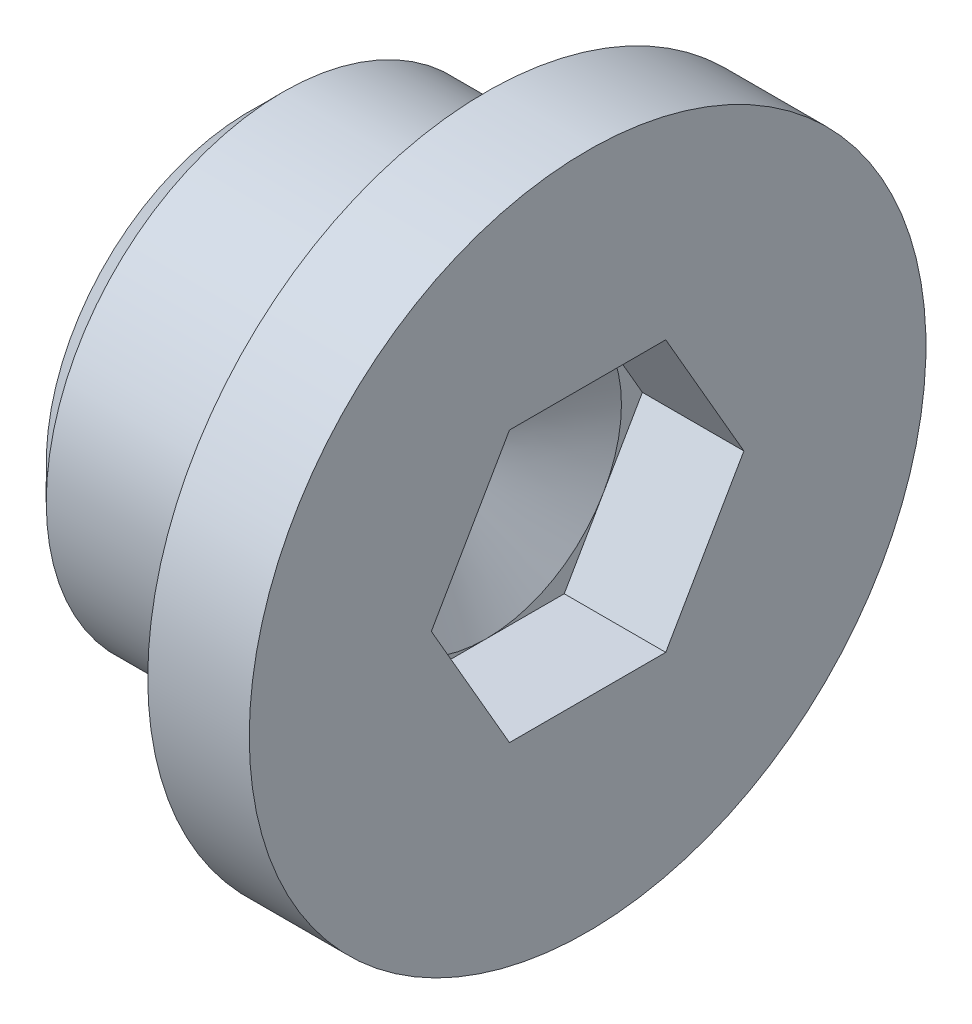
ISO-10303-21;
HEADER;
FILE_DESCRIPTION(('STEP AP214'),'2;1');
FILE_NAME('part.step','',(''),(''),'','','');
FILE_SCHEMA(('AUTOMOTIVE_DESIGN { 1 0 10303 214 1 1 1 1 }'));
ENDSEC;
DATA;
#1=APPLICATION_CONTEXT('core data for automotive mechanical design processes');
#2=APPLICATION_PROTOCOL_DEFINITION('international standard','automotive_design',2000,#1);
#3=PRODUCT_CONTEXT('',#1,'mechanical');
#4=PRODUCT('Part','Part','',(#3));
#5=PRODUCT_RELATED_PRODUCT_CATEGORY('part','',(#4));
#6=PRODUCT_DEFINITION_FORMATION('','',#4);
#7=PRODUCT_DEFINITION_CONTEXT('part definition',#1,'design');
#8=PRODUCT_DEFINITION('design','',#6,#7);
#9=PRODUCT_DEFINITION_SHAPE('','',#8);
#10=(LENGTH_UNIT() NAMED_UNIT(*) SI_UNIT(.MILLI.,.METRE.));
#11=(NAMED_UNIT(*) PLANE_ANGLE_UNIT() SI_UNIT($,.RADIAN.));
#12=(NAMED_UNIT(*) SI_UNIT($,.STERADIAN.) SOLID_ANGLE_UNIT());
#13=UNCERTAINTY_MEASURE_WITH_UNIT(LENGTH_MEASURE(1.E-05),#10,'distance_accuracy_value','');
#14=(GEOMETRIC_REPRESENTATION_CONTEXT(3) GLOBAL_UNCERTAINTY_ASSIGNED_CONTEXT((#13)) GLOBAL_UNIT_ASSIGNED_CONTEXT((#10,
#11,#12)) REPRESENTATION_CONTEXT('',''));
#15=CARTESIAN_POINT('',(0.,0.,0.));
#16=DIRECTION('',(0.,0.,1.));
#17=DIRECTION('',(1.,0.,0.));
#18=AXIS2_PLACEMENT_3D('',#15,#16,#17);
#19=CARTESIAN_POINT('',(10.,10.,0.));
#20=DIRECTION('',(-1.,0.,0.));
#21=DIRECTION('',(0.,0.,1.));
#22=AXIS2_PLACEMENT_3D('',#19,#20,#21);
#23=PLANE('',#22);
#24=DIRECTION('',(0.,0.,-1.));
#25=VECTOR('',#24,1.);
#26=CARTESIAN_POINT('',(10.,-4.,2.3094010767585));
#27=LINE('',#26,#25);
#28=CARTESIAN_POINT('',(10.,-4.,2.3094010767585));
#29=VERTEX_POINT('',#28);
#30=CARTESIAN_POINT('',(10.,-3.99999999999999,-2.30940107675846));
#31=VERTEX_POINT('',#30);
#32=EDGE_CURVE('E49',#29,#31,#27,.T.);
#33=ORIENTED_EDGE('',*,*,#32,.F.);
#34=DIRECTION('',(0.,-0.866025403784442,-0.499999999999993));
#35=VECTOR('',#34,1.);
#36=CARTESIAN_POINT('',(10.,0.,4.61880215351696));
#37=LINE('',#36,#35);
#38=CARTESIAN_POINT('',(10.,0.,4.61880215351696));
#39=VERTEX_POINT('',#38);
#40=EDGE_CURVE('E125',#39,#29,#37,.T.);
#41=ORIENTED_EDGE('',*,*,#40,.F.);
#42=DIRECTION('',(0.,-0.866025403784442,0.499999999999993));
#43=VECTOR('',#42,1.);
#44=CARTESIAN_POINT('',(10.,0.,4.61880215351696));
#45=LINE('',#44,#43);
#46=CARTESIAN_POINT('',(10.,4.,2.3094010767585));
#47=VERTEX_POINT('',#46);
#48=EDGE_CURVE('E119',#47,#39,#45,.T.);
#49=ORIENTED_EDGE('',*,*,#48,.F.);
#50=DIRECTION('',(0.,0.,1.));
#51=VECTOR('',#50,1.);
#52=CARTESIAN_POINT('',(10.,4.,2.3094010767585));
#53=LINE('',#52,#51);
#54=CARTESIAN_POINT('',(10.,4.,-2.30940107675848));
#55=VERTEX_POINT('',#54);
#56=EDGE_CURVE('E157',#55,#47,#53,.T.);
#57=ORIENTED_EDGE('',*,*,#56,.F.);
#58=DIRECTION('',(0.,0.866025403784442,0.499999999999993));
#59=VECTOR('',#58,1.);
#60=CARTESIAN_POINT('',(10.,0.,-4.61880215351693));
#61=LINE('',#60,#59);
#62=CARTESIAN_POINT('',(10.,0.,-4.61880215351693));
#63=VERTEX_POINT('',#62);
#64=EDGE_CURVE('E154',#63,#55,#61,.T.);
#65=ORIENTED_EDGE('',*,*,#64,.F.);
#66=DIRECTION('',(0.,0.866025403784442,-0.499999999999993));
#67=VECTOR('',#66,1.);
#68=CARTESIAN_POINT('',(10.,0.,-4.61880215351693));
#69=LINE('',#68,#67);
#70=EDGE_CURVE('E151',#31,#63,#69,.T.);
#71=ORIENTED_EDGE('',*,*,#70,.F.);
#72=EDGE_LOOP('',(#33,#41,#49,#57,#65,#71));
#73=FACE_BOUND('',#72,.T.);
#74=CARTESIAN_POINT('',(10.,0.,0.));
#75=DIRECTION('',(-1.,0.,0.));
#76=DIRECTION('',(0.,0.,1.));
#77=AXIS2_PLACEMENT_3D('',#74,#75,#76);
#78=CIRCLE('',#77,10.);
#79=CARTESIAN_POINT('',(10.,0.,10.));
#80=VERTEX_POINT('',#79);
#81=EDGE_CURVE('E189',#80,#80,#78,.T.);
#82=ORIENTED_EDGE('',*,*,#81,.F.);
#83=EDGE_LOOP('',(#82));
#84=FACE_BOUND('',#83,.T.);
#85=ADVANCED_FACE('F34',(#73,#84),#23,.F.);
#86=CARTESIAN_POINT('',(0.,0.,0.));
#87=DIRECTION('',(-1.,0.,0.));
#88=DIRECTION('',(0.,0.,1.));
#89=AXIS2_PLACEMENT_3D('',#86,#87,#88);
#90=CYLINDRICAL_SURFACE('',#89,10.);
#91=CARTESIAN_POINT('',(7.00000000000004,0.,0.));
#92=DIRECTION('',(-1.,0.,0.));
#93=DIRECTION('',(0.,0.,1.));
#94=AXIS2_PLACEMENT_3D('',#91,#92,#93);
#95=CIRCLE('',#94,10.);
#96=CARTESIAN_POINT('',(7.00000000000003,0.,10.));
#97=VERTEX_POINT('',#96);
#98=EDGE_CURVE('E186',#97,#97,#95,.T.);
#99=CARTESIAN_POINT('',(7.00000000000003,0.,10.));
#100=CARTESIAN_POINT('',(7.03125000000003,0.,10.));
#101=CARTESIAN_POINT('',(7.06250000000003,0.,10.));
#102=CARTESIAN_POINT('',(7.12500000000003,0.,10.));
#103=CARTESIAN_POINT('',(7.15625000000003,0.,10.));
#104=CARTESIAN_POINT('',(7.21875000000003,0.,10.));
#105=CARTESIAN_POINT('',(7.25000000000003,0.,10.));
#106=CARTESIAN_POINT('',(7.31250000000003,0.,10.));
#107=CARTESIAN_POINT('',(7.34375000000003,0.,10.));
#108=CARTESIAN_POINT('',(7.40625000000003,0.,10.));
#109=CARTESIAN_POINT('',(7.43750000000003,0.,10.));
#110=CARTESIAN_POINT('',(7.50000000000003,0.,10.));
#111=CARTESIAN_POINT('',(7.53125000000003,0.,10.));
#112=CARTESIAN_POINT('',(7.59375000000003,0.,10.));
#113=CARTESIAN_POINT('',(7.62500000000003,0.,10.));
#114=CARTESIAN_POINT('',(7.68750000000003,0.,10.));
#115=CARTESIAN_POINT('',(7.71875000000003,0.,10.));
#116=CARTESIAN_POINT('',(7.78125000000003,0.,10.));
#117=CARTESIAN_POINT('',(7.81250000000003,0.,10.));
#118=CARTESIAN_POINT('',(7.87500000000003,0.,10.));
#119=CARTESIAN_POINT('',(7.90625000000003,0.,10.));
#120=CARTESIAN_POINT('',(7.96875000000003,0.,10.));
#121=CARTESIAN_POINT('',(8.00000000000003,0.,10.));
#122=CARTESIAN_POINT('',(8.06250000000003,0.,10.));
#123=CARTESIAN_POINT('',(8.09375000000003,0.,10.));
#124=CARTESIAN_POINT('',(8.15625000000003,0.,10.));
#125=CARTESIAN_POINT('',(8.18750000000003,0.,10.));
#126=CARTESIAN_POINT('',(8.25000000000003,0.,10.));
#127=CARTESIAN_POINT('',(8.28125000000003,0.,10.));
#128=CARTESIAN_POINT('',(8.34375000000003,0.,10.));
#129=CARTESIAN_POINT('',(8.37500000000003,0.,10.));
#130=CARTESIAN_POINT('',(8.43750000000003,0.,10.));
#131=CARTESIAN_POINT('',(8.46875000000003,0.,10.));
#132=CARTESIAN_POINT('',(8.53125000000003,0.,10.));
#133=CARTESIAN_POINT('',(8.56250000000003,0.,10.));
#134=CARTESIAN_POINT('',(8.62500000000003,0.,10.));
#135=CARTESIAN_POINT('',(8.65625000000003,0.,10.));
#136=CARTESIAN_POINT('',(8.71875000000003,0.,10.));
#137=CARTESIAN_POINT('',(8.75000000000003,0.,10.));
#138=CARTESIAN_POINT('',(8.81250000000003,0.,10.));
#139=CARTESIAN_POINT('',(8.84375000000003,0.,10.));
#140=CARTESIAN_POINT('',(8.90625000000003,0.,10.));
#141=CARTESIAN_POINT('',(8.93750000000003,0.,10.));
#142=CARTESIAN_POINT('',(9.00000000000003,0.,10.));
#143=CARTESIAN_POINT('',(9.03125000000003,0.,10.));
#144=CARTESIAN_POINT('',(9.09375000000003,0.,10.));
#145=CARTESIAN_POINT('',(9.12500000000003,0.,10.));
#146=CARTESIAN_POINT('',(9.18750000000003,0.,10.));
#147=CARTESIAN_POINT('',(9.21875000000003,0.,10.));
#148=CARTESIAN_POINT('',(9.28125000000003,0.,10.));
#149=CARTESIAN_POINT('',(9.31250000000003,0.,10.));
#150=CARTESIAN_POINT('',(9.37500000000003,0.,10.));
#151=CARTESIAN_POINT('',(9.40625000000002,0.,10.));
#152=CARTESIAN_POINT('',(9.46875000000002,0.,10.));
#153=CARTESIAN_POINT('',(9.50000000000003,0.,10.));
#154=CARTESIAN_POINT('',(9.56250000000003,0.,10.));
#155=CARTESIAN_POINT('',(9.59375000000003,0.,10.));
#156=CARTESIAN_POINT('',(9.65625000000003,0.,10.));
#157=CARTESIAN_POINT('',(9.68750000000003,0.,10.));
#158=CARTESIAN_POINT('',(9.75000000000003,0.,10.));
#159=CARTESIAN_POINT('',(9.78125000000002,0.,10.));
#160=CARTESIAN_POINT('',(9.84375000000002,0.,10.));
#161=CARTESIAN_POINT('',(9.87500000000002,0.,10.));
#162=CARTESIAN_POINT('',(9.93750000000002,0.,10.));
#163=CARTESIAN_POINT('',(9.96875000000002,0.,10.));
#164=CARTESIAN_POINT('',(10.,0.,10.));
#165=B_SPLINE_CURVE_WITH_KNOTS('',3,(#99,#100,#101,#102,#103,#104,#105,#106,#107,#108,#109,#110,
#111,#112,#113,#114,#115,#116,#117,#118,#119,#120,#121,#122,#123,#124,#125,#126,#127,#128,#129,
#130,#131,#132,#133,#134,#135,#136,#137,#138,#139,#140,#141,#142,#143,#144,#145,#146,#147,#148,
#149,#150,#151,#152,#153,#154,#155,#156,#157,#158,#159,#160,#161,#162,#163,#164),.UNSPECIFIED.,
.F.,.F.,(4,2,2,2,2,2,2,2,2,2,2,2,2,2,2,2,2,2,2,2,2,2,2,2,2,2,2,2,2,2,2,2,4),(0.,
0.0937500000000001,0.187499999999999,0.281249999999999,0.374999999999999,0.468749999999999,
0.562499999999998,0.656249999999998,0.749999999999997,0.843749999999996,0.937499999999996,
1.03125,1.12499999999999,1.21875,1.3125,1.40625,1.5,1.59374999999999,1.68749999999999,
1.78124999999999,1.87499999999999,1.96874999999999,2.06249999999999,2.15624999999999,
2.24999999999999,2.34374999999999,2.43749999999999,2.53124999999999,2.62499999999999,
2.71874999999999,2.81249999999999,2.90624999999999,2.99999999999999),.UNSPECIFIED.);
#166=EDGE_CURVE('BSEAM207',#97,#80,#165,.T.);
#167=ORIENTED_EDGE('',*,*,#98,.F.);
#168=ORIENTED_EDGE('',*,*,#81,.T.);
#169=ORIENTED_EDGE('',*,*,#166,.T.);
#170=ORIENTED_EDGE('',*,*,#166,.F.);
#171=EDGE_LOOP('',(#167,#169,#168,#170));
#172=FACE_BOUND('',#171,.T.);
#173=ADVANCED_FACE('F207',(#172),#90,.T.);
#174=CARTESIAN_POINT('',(7.,7.,0.));
#175=DIRECTION('',(1.,0.,0.));
#176=DIRECTION('',(0.,0.,-1.));
#177=AXIS2_PLACEMENT_3D('',#174,#175,#176);
#178=PLANE('',#177);
#179=CARTESIAN_POINT('',(7.00000000000004,0.,0.));
#180=DIRECTION('',(-1.,0.,0.));
#181=DIRECTION('',(0.,0.,1.));
#182=AXIS2_PLACEMENT_3D('',#179,#180,#181);
#183=CIRCLE('',#182,7.);
#184=CARTESIAN_POINT('',(7.00000000000004,0.,7.));
#185=VERTEX_POINT('',#184);
#186=EDGE_CURVE('E183',#185,#185,#183,.T.);
#187=ORIENTED_EDGE('',*,*,#186,.F.);
#188=EDGE_LOOP('',(#187));
#189=FACE_BOUND('',#188,.T.);
#190=ORIENTED_EDGE('',*,*,#98,.T.);
#191=EDGE_LOOP('',(#190));
#192=FACE_BOUND('',#191,.T.);
#193=ADVANCED_FACE('F211',(#189,#192),#178,.F.);
#194=CARTESIAN_POINT('',(6.49189290423823,0.,0.));
#195=DIRECTION('',(-1.,0.,0.));
#196=DIRECTION('',(0.,0.,1.));
#197=AXIS2_PLACEMENT_3D('',#194,#195,#196);
#198=TOROIDAL_SURFACE('',#197,7.,0.508107095761772);
#199=CARTESIAN_POINT('',(5.98378580847648,0.,0.));
#200=DIRECTION('',(-1.,0.,0.));
#201=DIRECTION('',(0.,0.,1.));
#202=AXIS2_PLACEMENT_3D('',#199,#200,#201);
#203=CIRCLE('',#202,7.);
#204=CARTESIAN_POINT('',(5.98378580847648,0.,7.));
#205=VERTEX_POINT('',#204);
#206=EDGE_CURVE('E179',#205,#205,#203,.T.);
#207=ORIENTED_EDGE('',*,*,#206,.F.);
#208=EDGE_LOOP('',(#207));
#209=FACE_BOUND('',#208,.T.);
#210=ORIENTED_EDGE('',*,*,#186,.T.);
#211=EDGE_LOOP('',(#210));
#212=FACE_BOUND('',#211,.T.);
#213=ADVANCED_FACE('F218',(#209,#212),#198,.F.);
#214=CARTESIAN_POINT('',(0.,0.,0.));
#215=DIRECTION('',(-1.,0.,0.));
#216=DIRECTION('',(0.,0.,1.));
#217=AXIS2_PLACEMENT_3D('',#214,#215,#216);
#218=CYLINDRICAL_SURFACE('',#217,7.);
#219=CARTESIAN_POINT('',(1.00000000000001,0.,0.));
#220=DIRECTION('',(1.,0.,0.));
#221=DIRECTION('',(0.,0.,-1.));
#222=AXIS2_PLACEMENT_3D('',#219,#220,#221);
#223=CIRCLE('',#222,7.);
#224=CARTESIAN_POINT('',(1.00000000000001,0.,7.));
#225=VERTEX_POINT('',#224);
#226=EDGE_CURVE('E11',#225,#225,#223,.T.);
#227=CARTESIAN_POINT('',(1.00000000000001,0.,7.));
#228=CARTESIAN_POINT('',(1.05191443550497,0.,7.));
#229=CARTESIAN_POINT('',(1.10382887100993,0.,7.));
#230=CARTESIAN_POINT('',(1.20765774201986,0.,7.));
#231=CARTESIAN_POINT('',(1.25957217752482,0.,7.));
#232=CARTESIAN_POINT('',(1.36340104853475,0.,7.));
#233=CARTESIAN_POINT('',(1.41531548403971,0.,7.));
#234=CARTESIAN_POINT('',(1.51914435504964,0.,7.));
#235=CARTESIAN_POINT('',(1.5710587905546,0.,7.));
#236=CARTESIAN_POINT('',(1.67488766156453,0.,7.));
#237=CARTESIAN_POINT('',(1.72680209706949,0.,7.));
#238=CARTESIAN_POINT('',(1.83063096807942,0.,7.));
#239=CARTESIAN_POINT('',(1.88254540358438,0.,7.));
#240=CARTESIAN_POINT('',(1.98637427459431,0.,7.));
#241=CARTESIAN_POINT('',(2.03828871009927,0.,7.));
#242=CARTESIAN_POINT('',(2.1421175811092,0.,7.));
#243=CARTESIAN_POINT('',(2.19403201661416,0.,7.));
#244=CARTESIAN_POINT('',(2.29786088762409,0.,7.));
#245=CARTESIAN_POINT('',(2.34977532312905,0.,7.));
#246=CARTESIAN_POINT('',(2.45360419413898,0.,7.));
#247=CARTESIAN_POINT('',(2.50551862964394,0.,7.));
#248=CARTESIAN_POINT('',(2.60934750065387,0.,7.));
#249=CARTESIAN_POINT('',(2.66126193615883,0.,7.));
#250=CARTESIAN_POINT('',(2.76509080716876,0.,7.));
#251=CARTESIAN_POINT('',(2.81700524267372,0.,7.));
#252=CARTESIAN_POINT('',(2.92083411368365,0.,7.));
#253=CARTESIAN_POINT('',(2.97274854918861,0.,7.));
#254=CARTESIAN_POINT('',(3.07657742019854,0.,7.));
#255=CARTESIAN_POINT('',(3.1284918557035,0.,7.));
#256=CARTESIAN_POINT('',(3.23232072671343,0.,7.));
#257=CARTESIAN_POINT('',(3.28423516221839,0.,7.));
#258=CARTESIAN_POINT('',(3.38806403322832,0.,7.));
#259=CARTESIAN_POINT('',(3.43997846873328,0.,7.));
#260=CARTESIAN_POINT('',(3.54380733974321,0.,7.));
#261=CARTESIAN_POINT('',(3.59572177524817,0.,7.));
#262=CARTESIAN_POINT('',(3.6995506462581,0.,7.));
#263=CARTESIAN_POINT('',(3.75146508176306,0.,7.));
#264=CARTESIAN_POINT('',(3.85529395277299,0.,7.));
#265=CARTESIAN_POINT('',(3.90720838827795,0.,7.));
#266=CARTESIAN_POINT('',(4.01103725928788,0.,7.));
#267=CARTESIAN_POINT('',(4.06295169479284,0.,7.));
#268=CARTESIAN_POINT('',(4.16678056580276,0.,7.));
#269=CARTESIAN_POINT('',(4.21869500130773,0.,7.));
#270=CARTESIAN_POINT('',(4.32252387231765,0.,7.));
#271=CARTESIAN_POINT('',(4.37443830782262,0.,7.));
#272=CARTESIAN_POINT('',(4.47826717883254,0.,7.));
#273=CARTESIAN_POINT('',(4.53018161433751,0.,7.));
#274=CARTESIAN_POINT('',(4.63401048534744,0.,7.));
#275=CARTESIAN_POINT('',(4.6859249208524,0.,7.));
#276=CARTESIAN_POINT('',(4.78975379186232,0.,7.));
#277=CARTESIAN_POINT('',(4.84166822736729,0.,7.));
#278=CARTESIAN_POINT('',(4.94549709837721,0.,7.));
#279=CARTESIAN_POINT('',(4.99741153388218,0.,7.));
#280=CARTESIAN_POINT('',(5.1012404048921,0.,7.));
#281=CARTESIAN_POINT('',(5.15315484039707,0.,7.));
#282=CARTESIAN_POINT('',(5.25698371140699,0.,7.));
#283=CARTESIAN_POINT('',(5.30889814691196,0.,7.));
#284=CARTESIAN_POINT('',(5.41272701792188,0.,7.));
#285=CARTESIAN_POINT('',(5.46464145342685,0.,7.));
#286=CARTESIAN_POINT('',(5.56847032443677,0.,7.));
#287=CARTESIAN_POINT('',(5.62038475994174,0.,7.));
#288=CARTESIAN_POINT('',(5.72421363095166,0.,7.));
#289=CARTESIAN_POINT('',(5.77612806645663,0.,7.));
#290=CARTESIAN_POINT('',(5.87995693746655,0.,7.));
#291=CARTESIAN_POINT('',(5.93187137297152,0.,7.));
#292=CARTESIAN_POINT('',(5.98378580847648,0.,7.));
#293=B_SPLINE_CURVE_WITH_KNOTS('',3,(#227,#228,#229,#230,#231,#232,#233,#234,#235,#236,#237,
#238,#239,#240,#241,#242,#243,#244,#245,#246,#247,#248,#249,#250,#251,#252,#253,#254,#255,#256,
#257,#258,#259,#260,#261,#262,#263,#264,#265,#266,#267,#268,#269,#270,#271,#272,#273,#274,#275,
#276,#277,#278,#279,#280,#281,#282,#283,#284,#285,#286,#287,#288,#289,#290,#291,#292),
.UNSPECIFIED.,.F.,.F.,(4,2,2,2,2,2,2,2,2,2,2,2,2,2,2,2,2,2,2,2,2,2,2,2,2,2,2,2,2,2,2,2,4),(0.,
0.15574330651489,0.31148661302978,0.467229919544669,0.622973226059559,0.778716532574449,
0.934459839089339,1.09020314560423,1.24594645211912,1.40168975863401,1.5574330651489,
1.71317637166379,1.86891967817868,2.02466298469357,2.18040629120846,2.33614959772335,
2.49189290423824,2.64763621075313,2.80337951726802,2.95912282378291,3.1148661302978,
3.27060943681269,3.42635274332758,3.58209604984247,3.73783935635736,3.89358266287225,
4.04932596938714,4.20506927590203,4.36081258241692,4.51655588893181,4.6722991954467,
4.82804250196159,4.98378580847647),.UNSPECIFIED.);
#294=EDGE_CURVE('BSEAM222',#225,#205,#293,.T.);
#295=ORIENTED_EDGE('',*,*,#226,.T.);
#296=ORIENTED_EDGE('',*,*,#206,.T.);
#297=ORIENTED_EDGE('',*,*,#294,.T.);
#298=ORIENTED_EDGE('',*,*,#294,.F.);
#299=EDGE_LOOP('',(#295,#297,#296,#298));
#300=FACE_BOUND('',#299,.T.);
#301=ADVANCED_FACE('F222',(#300),#218,.T.);
#302=CARTESIAN_POINT('',(0.,0.,0.));
#303=DIRECTION('',(1.,0.,0.));
#304=DIRECTION('',(0.,0.,-1.));
#305=AXIS2_PLACEMENT_3D('',#302,#303,#304);
#306=PLANE('',#305);
#307=CARTESIAN_POINT('',(0.,0.,0.));
#308=DIRECTION('',(1.,0.,0.));
#309=DIRECTION('',(0.,0.,-1.));
#310=AXIS2_PLACEMENT_3D('',#307,#308,#309);
#311=CIRCLE('',#310,5.99999999999999);
#312=CARTESIAN_POINT('',(0.,0.,-5.99999999999999));
#313=VERTEX_POINT('',#312);
#314=EDGE_CURVE('E42',#313,#313,#311,.F.);
#315=ORIENTED_EDGE('',*,*,#314,.T.);
#316=EDGE_LOOP('',(#315));
#317=FACE_BOUND('',#316,.T.);
#318=ADVANCED_FACE('F194',(#317),#306,.F.);
#319=CARTESIAN_POINT('',(7.,0.,4.61880215351697));
#320=DIRECTION('',(0.,-0.499999999999994,0.866025403784442));
#321=DIRECTION('',(0.,-0.866025403784443,-0.499999999999993));
#322=AXIS2_PLACEMENT_3D('',#319,#320,#321);
#323=PLANE('',#322);
#324=ORIENTED_EDGE('',*,*,#40,.T.);
#325=DIRECTION('',(1.,0.,0.));
#326=VECTOR('',#325,1.);
#327=CARTESIAN_POINT('',(7.,-4.,2.30940107675849));
#328=LINE('',#327,#326);
#329=CARTESIAN_POINT('',(7.,-4.,2.30940107675849));
#330=VERTEX_POINT('',#329);
#331=EDGE_CURVE('E122',#330,#29,#328,.T.);
#332=ORIENTED_EDGE('',*,*,#331,.F.);
#333=DIRECTION('',(0.,-0.866025403784442,-0.499999999999993));
#334=VECTOR('',#333,1.);
#335=CARTESIAN_POINT('',(7.,0.,4.61880215351697));
#336=LINE('',#335,#334);
#337=CARTESIAN_POINT('',(7.00000000000002,-1.99999999999995,3.46410161513776));
#338=VERTEX_POINT('',#337);
#339=EDGE_CURVE('E108',#338,#330,#336,.T.);
#340=ORIENTED_EDGE('',*,*,#339,.F.);
#341=CARTESIAN_POINT('',(7.,0.,4.61880215351697));
#342=VERTEX_POINT('',#341);
#343=EDGE_CURVE('E118',#342,#338,#336,.T.);
#344=ORIENTED_EDGE('',*,*,#343,.F.);
#345=DIRECTION('',(1.,0.,0.));
#346=VECTOR('',#345,1.);
#347=CARTESIAN_POINT('',(7.,0.,4.61880215351697));
#348=LINE('',#347,#346);
#349=EDGE_CURVE('E162',#342,#39,#348,.T.);
#350=ORIENTED_EDGE('',*,*,#349,.T.);
#351=EDGE_LOOP('',(#324,#332,#340,#344,#350));
#352=FACE_BOUND('',#351,.T.);
#353=ADVANCED_FACE('F123',(#352),#323,.F.);
#354=CARTESIAN_POINT('',(7.,0.,4.61880215351697));
#355=DIRECTION('',(0.,0.499999999999993,0.866025403784442));
#356=DIRECTION('',(0.,-0.866025403784443,0.499999999999994));
#357=AXIS2_PLACEMENT_3D('',#354,#355,#356);
#358=PLANE('',#357);
#359=ORIENTED_EDGE('',*,*,#48,.T.);
#360=ORIENTED_EDGE('',*,*,#349,.F.);
#361=DIRECTION('',(0.,-0.866025403784442,0.499999999999993));
#362=VECTOR('',#361,1.);
#363=CARTESIAN_POINT('',(7.,0.,4.61880215351697));
#364=LINE('',#363,#362);
#365=CARTESIAN_POINT('',(7.00000000000002,1.99999999999996,3.46410161513777));
#366=VERTEX_POINT('',#365);
#367=EDGE_CURVE('E146',#366,#342,#364,.T.);
#368=ORIENTED_EDGE('',*,*,#367,.F.);
#369=CARTESIAN_POINT('',(7.,4.,2.3094010767585));
#370=VERTEX_POINT('',#369);
#371=EDGE_CURVE('E128',#370,#366,#364,.T.);
#372=ORIENTED_EDGE('',*,*,#371,.F.);
#373=DIRECTION('',(1.,0.,0.));
#374=VECTOR('',#373,1.);
#375=CARTESIAN_POINT('',(7.,4.,2.3094010767585));
#376=LINE('',#375,#374);
#377=EDGE_CURVE('E165',#370,#47,#376,.T.);
#378=ORIENTED_EDGE('',*,*,#377,.T.);
#379=EDGE_LOOP('',(#359,#360,#368,#372,#378));
#380=FACE_BOUND('',#379,.T.);
#381=ADVANCED_FACE('F231',(#380),#358,.F.);
#382=CARTESIAN_POINT('',(7.,4.,2.3094010767585));
#383=DIRECTION('',(0.,1.,0.));
#384=DIRECTION('',(0.,0.,1.));
#385=AXIS2_PLACEMENT_3D('',#382,#383,#384);
#386=PLANE('',#385);
#387=ORIENTED_EDGE('',*,*,#56,.T.);
#388=ORIENTED_EDGE('',*,*,#377,.F.);
#389=DIRECTION('',(0.,0.,1.));
#390=VECTOR('',#389,1.);
#391=CARTESIAN_POINT('',(7.,4.,2.3094010767585));
#392=LINE('',#391,#390);
#393=CARTESIAN_POINT('',(7.00000000000001,4.,0.));
#394=VERTEX_POINT('',#393);
#395=EDGE_CURVE('E142',#394,#370,#392,.T.);
#396=ORIENTED_EDGE('',*,*,#395,.F.);
#397=CARTESIAN_POINT('',(7.00000000000001,4.,-2.30940107675848));
#398=VERTEX_POINT('',#397);
#399=EDGE_CURVE('E143',#398,#394,#392,.T.);
#400=ORIENTED_EDGE('',*,*,#399,.F.);
#401=DIRECTION('',(1.,0.,0.));
#402=VECTOR('',#401,1.);
#403=CARTESIAN_POINT('',(7.00000000000001,4.,-2.30940107675848));
#404=LINE('',#403,#402);
#405=EDGE_CURVE('E168',#398,#55,#404,.T.);
#406=ORIENTED_EDGE('',*,*,#405,.T.);
#407=EDGE_LOOP('',(#387,#388,#396,#400,#406));
#408=FACE_BOUND('',#407,.T.);
#409=ADVANCED_FACE('F242',(#408),#386,.F.);
#410=CARTESIAN_POINT('',(7.00000000000001,0.,-4.61880215351694));
#411=DIRECTION('',(0.,0.499999999999994,-0.866025403784442));
#412=DIRECTION('',(0.,0.866025403784443,0.499999999999993));
#413=AXIS2_PLACEMENT_3D('',#410,#411,#412);
#414=PLANE('',#413);
#415=ORIENTED_EDGE('',*,*,#64,.T.);
#416=ORIENTED_EDGE('',*,*,#405,.F.);
#417=DIRECTION('',(0.,0.866025403784442,0.499999999999993));
#418=VECTOR('',#417,1.);
#419=CARTESIAN_POINT('',(7.00000000000001,0.,-4.61880215351694));
#420=LINE('',#419,#418);
#421=CARTESIAN_POINT('',(7.,1.99999999999998,-3.46410161513776));
#422=VERTEX_POINT('',#421);
#423=EDGE_CURVE('E140',#422,#398,#420,.T.);
#424=ORIENTED_EDGE('',*,*,#423,.F.);
#425=CARTESIAN_POINT('',(7.00000000000001,0.,-4.61880215351694));
#426=VERTEX_POINT('',#425);
#427=EDGE_CURVE('E57',#426,#422,#420,.T.);
#428=ORIENTED_EDGE('',*,*,#427,.F.);
#429=DIRECTION('',(1.,0.,0.));
#430=VECTOR('',#429,1.);
#431=CARTESIAN_POINT('',(7.00000000000001,0.,-4.61880215351694));
#432=LINE('',#431,#430);
#433=EDGE_CURVE('E171',#426,#63,#432,.T.);
#434=ORIENTED_EDGE('',*,*,#433,.T.);
#435=EDGE_LOOP('',(#415,#416,#424,#428,#434));
#436=FACE_BOUND('',#435,.T.);
#437=ADVANCED_FACE('F238',(#436),#414,.F.);
#438=CARTESIAN_POINT('',(7.00000000000001,0.,-4.61880215351694));
#439=DIRECTION('',(0.,-0.499999999999993,-0.866025403784442));
#440=DIRECTION('',(0.,0.866025403784443,-0.499999999999994));
#441=AXIS2_PLACEMENT_3D('',#438,#439,#440);
#442=PLANE('',#441);
#443=ORIENTED_EDGE('',*,*,#70,.T.);
#444=ORIENTED_EDGE('',*,*,#433,.F.);
#445=DIRECTION('',(0.,0.866025403784442,-0.499999999999993));
#446=VECTOR('',#445,1.);
#447=CARTESIAN_POINT('',(7.00000000000001,0.,-4.61880215351694));
#448=LINE('',#447,#446);
#449=CARTESIAN_POINT('',(7.,-1.99999999999996,-3.46410161513774));
#450=VERTEX_POINT('',#449);
#451=EDGE_CURVE('E134',#450,#426,#448,.T.);
#452=ORIENTED_EDGE('',*,*,#451,.F.);
#453=CARTESIAN_POINT('',(7.00000000000004,-3.99999999999999,-2.30940107675848));
#454=VERTEX_POINT('',#453);
#455=EDGE_CURVE('E136',#454,#450,#448,.T.);
#456=ORIENTED_EDGE('',*,*,#455,.F.);
#457=DIRECTION('',(1.,0.,0.));
#458=VECTOR('',#457,1.);
#459=CARTESIAN_POINT('',(7.00000000000004,-3.99999999999999,-2.30940107675848));
#460=LINE('',#459,#458);
#461=EDGE_CURVE('E127',#454,#31,#460,.T.);
#462=ORIENTED_EDGE('',*,*,#461,.T.);
#463=EDGE_LOOP('',(#443,#444,#452,#456,#462));
#464=FACE_BOUND('',#463,.T.);
#465=ADVANCED_FACE('F235',(#464),#442,.F.);
#466=CARTESIAN_POINT('',(7.,-4.,2.30940107675849));
#467=DIRECTION('',(0.,-1.,0.));
#468=DIRECTION('',(0.,0.,-1.));
#469=AXIS2_PLACEMENT_3D('',#466,#467,#468);
#470=PLANE('',#469);
#471=ORIENTED_EDGE('',*,*,#32,.T.);
#472=ORIENTED_EDGE('',*,*,#461,.F.);
#473=DIRECTION('',(0.,0.,-1.));
#474=VECTOR('',#473,1.);
#475=CARTESIAN_POINT('',(7.,-4.,2.30940107675849));
#476=LINE('',#475,#474);
#477=CARTESIAN_POINT('',(7.00000000000002,-4.,0.));
#478=VERTEX_POINT('',#477);
#479=EDGE_CURVE('E133',#478,#454,#476,.T.);
#480=ORIENTED_EDGE('',*,*,#479,.F.);
#481=EDGE_CURVE('E112',#330,#478,#476,.T.);
#482=ORIENTED_EDGE('',*,*,#481,.F.);
#483=ORIENTED_EDGE('',*,*,#331,.T.);
#484=EDGE_LOOP('',(#471,#472,#480,#482,#483));
#485=FACE_BOUND('',#484,.T.);
#486=ADVANCED_FACE('F131',(#485),#470,.F.);
#487=CARTESIAN_POINT('',(7.,-4.,2.30940107675849));
#488=DIRECTION('',(1.,0.,0.));
#489=DIRECTION('',(0.,0.,-1.));
#490=AXIS2_PLACEMENT_3D('',#487,#488,#489);
#491=PLANE('',#490);
#492=CARTESIAN_POINT('',(7.00000000000004,0.,0.));
#493=DIRECTION('',(1.,0.,0.));
#494=DIRECTION('',(0.,0.,-1.));
#495=AXIS2_PLACEMENT_3D('',#492,#493,#494);
#496=CIRCLE('',#495,4.);
#497=EDGE_CURVE('E268',#478,#450,#496,.T.);
#498=ORIENTED_EDGE('',*,*,#497,.F.);
#499=ORIENTED_EDGE('',*,*,#479,.T.);
#500=ORIENTED_EDGE('',*,*,#455,.T.);
#501=EDGE_LOOP('',(#498,#499,#500));
#502=FACE_BOUND('',#501,.T.);
#503=ADVANCED_FACE('F234',(#502),#491,.T.);
#504=EDGE_CURVE('E114',#338,#478,#496,.T.);
#505=ORIENTED_EDGE('',*,*,#504,.F.);
#506=ORIENTED_EDGE('',*,*,#339,.T.);
#507=ORIENTED_EDGE('',*,*,#481,.T.);
#508=EDGE_LOOP('',(#505,#506,#507));
#509=FACE_BOUND('',#508,.T.);
#510=ADVANCED_FACE('F110',(#509),#491,.T.);
#511=EDGE_CURVE('E271',#366,#338,#496,.T.);
#512=ORIENTED_EDGE('',*,*,#511,.F.);
#513=ORIENTED_EDGE('',*,*,#367,.T.);
#514=ORIENTED_EDGE('',*,*,#343,.T.);
#515=EDGE_LOOP('',(#512,#513,#514));
#516=FACE_BOUND('',#515,.T.);
#517=ADVANCED_FACE('F255',(#516),#491,.T.);
#518=EDGE_CURVE('E180',#394,#366,#496,.T.);
#519=ORIENTED_EDGE('',*,*,#518,.F.);
#520=ORIENTED_EDGE('',*,*,#395,.T.);
#521=ORIENTED_EDGE('',*,*,#371,.T.);
#522=EDGE_LOOP('',(#519,#520,#521));
#523=FACE_BOUND('',#522,.T.);
#524=ADVANCED_FACE('F261',(#523),#491,.T.);
#525=EDGE_CURVE('E176',#422,#394,#496,.T.);
#526=ORIENTED_EDGE('',*,*,#525,.F.);
#527=ORIENTED_EDGE('',*,*,#423,.T.);
#528=ORIENTED_EDGE('',*,*,#399,.T.);
#529=EDGE_LOOP('',(#526,#527,#528));
#530=FACE_BOUND('',#529,.T.);
#531=ADVANCED_FACE('F257',(#530),#491,.T.);
#532=EDGE_CURVE('E164',#450,#422,#496,.T.);
#533=ORIENTED_EDGE('',*,*,#532,.F.);
#534=ORIENTED_EDGE('',*,*,#451,.T.);
#535=ORIENTED_EDGE('',*,*,#427,.T.);
#536=EDGE_LOOP('',(#533,#534,#535));
#537=FACE_BOUND('',#536,.T.);
#538=ADVANCED_FACE('F202',(#537),#491,.T.);
#539=CARTESIAN_POINT('',(7.00000000000004,0.,0.));
#540=DIRECTION('',(1.,0.,0.));
#541=DIRECTION('',(0.,0.,-1.));
#542=AXIS2_PLACEMENT_3D('',#539,#540,#541);
#543=CONICAL_SURFACE('',#542,4.,1.02974425867665);
#544=CARTESIAN_POINT('',(4.59655752388976,0.,0.));
#545=VERTEX_POINT('',#544);
#546=VERTEX_LOOP('',#545);
#547=FACE_BOUND('',#546,.T.);
#548=ORIENTED_EDGE('',*,*,#525,.T.);
#549=ORIENTED_EDGE('',*,*,#518,.T.);
#550=ORIENTED_EDGE('',*,*,#511,.T.);
#551=ORIENTED_EDGE('',*,*,#504,.T.);
#552=ORIENTED_EDGE('',*,*,#497,.T.);
#553=ORIENTED_EDGE('',*,*,#532,.T.);
#554=EDGE_LOOP('',(#548,#549,#550,#551,#552,#553));
#555=FACE_BOUND('',#554,.T.);
#556=ADVANCED_FACE('F197',(#547,#555),#543,.F.);
#557=CARTESIAN_POINT('',(0.,0.,0.));
#558=DIRECTION('',(1.,0.,0.));
#559=DIRECTION('',(0.,0.,-1.));
#560=AXIS2_PLACEMENT_3D('',#557,#558,#559);
#561=CONICAL_SURFACE('',#560,5.99999999999999,0.785398163397448);
#562=ORIENTED_EDGE('',*,*,#226,.F.);
#563=EDGE_LOOP('',(#562));
#564=FACE_BOUND('',#563,.T.);
#565=ORIENTED_EDGE('',*,*,#314,.F.);
#566=EDGE_LOOP('',(#565));
#567=FACE_BOUND('',#566,.T.);
#568=ADVANCED_FACE('F36',(#564,#567),#561,.T.);
#569=CLOSED_SHELL('',(#85,#173,#193,#213,#301,#318,#353,#381,#409,#437,#465,#486,#503,#510,#517,
#524,#531,#538,#556,#568));
#570=MANIFOLD_SOLID_BREP('B2',#569);
#571=ADVANCED_BREP_SHAPE_REPRESENTATION('',(#18,#570),#14);
#572=SHAPE_DEFINITION_REPRESENTATION(#9,#571);
ENDSEC;
END-ISO-10303-21;
